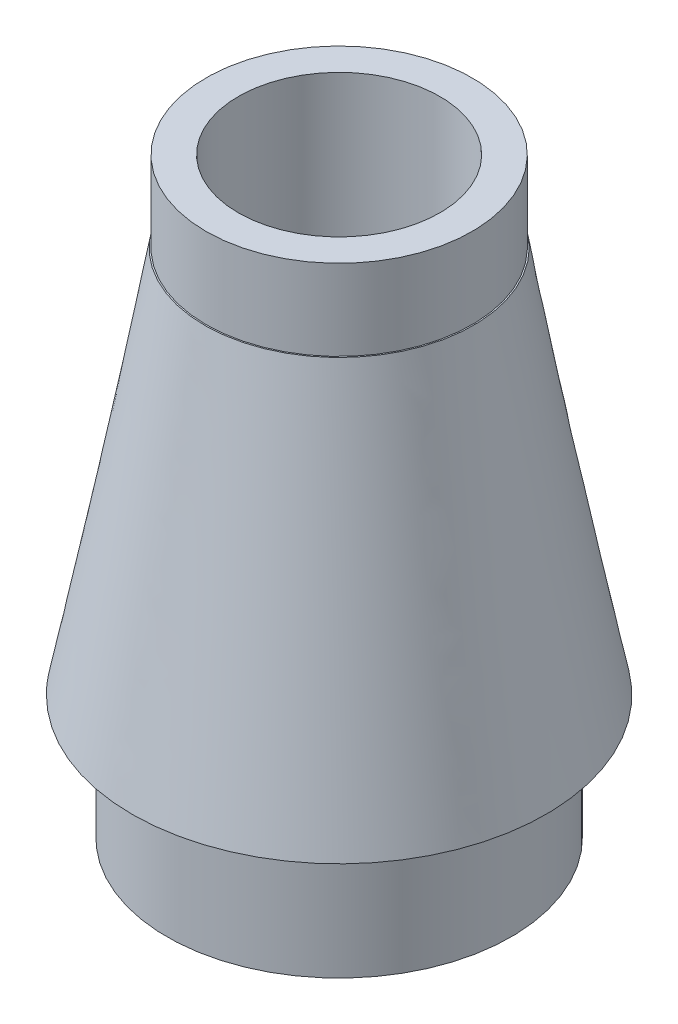
ISO-10303-21;
HEADER;
FILE_DESCRIPTION(('STEP AP214'),'2;1');
FILE_NAME('part.step','',(''),(''),'','','');
FILE_SCHEMA(('AUTOMOTIVE_DESIGN { 1 0 10303 214 1 1 1 1 }'));
ENDSEC;
DATA;
#1=APPLICATION_CONTEXT('core data for automotive mechanical design processes');
#2=APPLICATION_PROTOCOL_DEFINITION('international standard','automotive_design',2000,#1);
#3=PRODUCT_CONTEXT('',#1,'mechanical');
#4=PRODUCT('Part','Part','',(#3));
#5=PRODUCT_RELATED_PRODUCT_CATEGORY('part','',(#4));
#6=PRODUCT_DEFINITION_FORMATION('','',#4);
#7=PRODUCT_DEFINITION_CONTEXT('part definition',#1,'design');
#8=PRODUCT_DEFINITION('design','',#6,#7);
#9=PRODUCT_DEFINITION_SHAPE('','',#8);
#10=(LENGTH_UNIT() NAMED_UNIT(*) SI_UNIT(.MILLI.,.METRE.));
#11=(NAMED_UNIT(*) PLANE_ANGLE_UNIT() SI_UNIT($,.RADIAN.));
#12=(NAMED_UNIT(*) SI_UNIT($,.STERADIAN.) SOLID_ANGLE_UNIT());
#13=UNCERTAINTY_MEASURE_WITH_UNIT(LENGTH_MEASURE(1.E-05),#10,'distance_accuracy_value','');
#14=(GEOMETRIC_REPRESENTATION_CONTEXT(3) GLOBAL_UNCERTAINTY_ASSIGNED_CONTEXT((#13)) GLOBAL_UNIT_ASSIGNED_CONTEXT((#10,
#11,#12)) REPRESENTATION_CONTEXT('',''));
#15=CARTESIAN_POINT('',(0.,0.,0.));
#16=DIRECTION('',(0.,0.,1.));
#17=DIRECTION('',(1.,0.,0.));
#18=AXIS2_PLACEMENT_3D('',#15,#16,#17);
#19=CARTESIAN_POINT('',(0.,2.3,0.));
#20=DIRECTION('',(0.,1.,0.));
#21=DIRECTION('',(0.,0.,1.));
#22=AXIS2_PLACEMENT_3D('',#19,#20,#21);
#23=PLANE('',#22);
#24=CARTESIAN_POINT('',(0.,2.3,0.));
#25=DIRECTION('',(0.,1.,0.));
#26=DIRECTION('',(0.,0.,1.));
#27=AXIS2_PLACEMENT_3D('',#24,#25,#26);
#28=CIRCLE('',#27,3.85);
#29=CARTESIAN_POINT('',(3.50290491011307,2.3,-1.59754724208887));
#30=VERTEX_POINT('',#29);
#31=EDGE_CURVE('E46',#30,#30,#28,.T.);
#32=ORIENTED_EDGE('',*,*,#31,.F.);
#33=EDGE_LOOP('',(#32));
#34=FACE_BOUND('',#33,.T.);
#35=CARTESIAN_POINT('',(0.,2.29999999999109,0.));
#36=DIRECTION('',(0.,1.,0.));
#37=DIRECTION('',(0.,0.,1.));
#38=AXIS2_PLACEMENT_3D('',#35,#36,#37);
#39=CIRCLE('',#38,3.2);
#40=CARTESIAN_POINT('',(0.,2.29999999999109,-3.2));
#41=VERTEX_POINT('',#40);
#42=EDGE_CURVE('E11',#41,#41,#39,.F.);
#43=ORIENTED_EDGE('',*,*,#42,.F.);
#44=EDGE_LOOP('',(#43));
#45=FACE_BOUND('',#44,.T.);
#46=ADVANCED_FACE('F34',(#34,#45),#23,.F.);
#47=CARTESIAN_POINT('',(0.,9.5,0.));
#48=DIRECTION('',(0.,1.,0.));
#49=DIRECTION('',(0.,0.,1.));
#50=AXIS2_PLACEMENT_3D('',#47,#48,#49);
#51=PLANE('',#50);
#52=CARTESIAN_POINT('',(0.,9.50000000000273,0.));
#53=DIRECTION('',(0.,1.,0.));
#54=DIRECTION('',(0.,0.,1.));
#55=AXIS2_PLACEMENT_3D('',#52,#53,#54);
#56=CIRCLE('',#55,2.475);
#57=CARTESIAN_POINT('',(0.,9.50000000000273,2.475));
#58=VERTEX_POINT('',#57);
#59=EDGE_CURVE('E42',#58,#58,#56,.T.);
#60=ORIENTED_EDGE('',*,*,#59,.F.);
#61=EDGE_LOOP('',(#60));
#62=FACE_BOUND('',#61,.T.);
#63=CARTESIAN_POINT('',(0.,9.5,0.));
#64=DIRECTION('',(0.,1.,0.));
#65=DIRECTION('',(0.,0.,1.));
#66=AXIS2_PLACEMENT_3D('',#63,#64,#65);
#67=CIRCLE('',#66,2.5);
#68=CARTESIAN_POINT('',(2.46542534057247,9.5,-0.414340307070299));
#69=VERTEX_POINT('',#68);
#70=EDGE_CURVE('E50',#69,#69,#67,.T.);
#71=ORIENTED_EDGE('',*,*,#70,.T.);
#72=EDGE_LOOP('',(#71));
#73=FACE_BOUND('',#72,.T.);
#74=ADVANCED_FACE('F36',(#62,#73),#51,.T.);
#75=CARTESIAN_POINT('',(3.50290491011307,2.3,-1.59754724208887));
#76=CARTESIAN_POINT('',(2.46542534057247,9.5,-0.414340307070299));
#77=CARTESIAN_POINT('',(0.307810425935332,2.3,-8.603357062315));
#78=CARTESIAN_POINT('',(1.63674472643187,9.5,-5.34519098821524));
#79=CARTESIAN_POINT('',(-6.6979993942908,2.3,-5.40826257813726));
#80=CARTESIAN_POINT('',(-3.29410595471307,9.5,-4.51651037407464));
#81=CARTESIAN_POINT('',(-3.50290491011307,2.3,1.59754724208887));
#82=CARTESIAN_POINT('',(-2.46542534057247,9.5,0.4143403070703));
#83=CARTESIAN_POINT('',(-0.307810425935336,2.3,8.60335706231501));
#84=CARTESIAN_POINT('',(-1.63674472643187,9.5,5.34519098821524));
#85=CARTESIAN_POINT('',(6.6979993942908,2.3,5.40826257813727));
#86=CARTESIAN_POINT('',(3.29410595471307,9.5,4.51651037407464));
#87=CARTESIAN_POINT('',(3.50290491011307,2.3,-1.59754724208887));
#88=CARTESIAN_POINT('',(2.46542534057247,9.5,-0.414340307070299));
#89=(BOUNDED_SURFACE() B_SPLINE_SURFACE(3,1,((#75,#76),(#77,#78),(#79,#80),(#81,#82),(#83,#84),
(#85,#86),(#87,#88)),.UNSPECIFIED.,.T.,.F.,.F.) B_SPLINE_SURFACE_WITH_KNOTS((4,3,4),(2,2),(0.,
0.5,1.),(0.,1.),.UNSPECIFIED.) GEOMETRIC_REPRESENTATION_ITEM() RATIONAL_B_SPLINE_SURFACE(((1.,
1.),(0.333333333333334,0.333333333333333),(0.333333333333334,0.333333333333333),(1.,1.),
(0.333333333333333,0.333333333333333),(0.333333333333333,0.333333333333333),(1.,1.))) REPRESENTATION_ITEM('') SURFACE());
#90=CARTESIAN_POINT('',(3.50290491011307,2.3,-1.59754724208887));
#91=CARTESIAN_POINT('',(3.49209783126369,2.375,-1.58522216984909));
#92=CARTESIAN_POINT('',(3.48129075241431,2.45,-1.57289709760932));
#93=CARTESIAN_POINT('',(3.45967659471554,2.6,-1.54824695312976));
#94=CARTESIAN_POINT('',(3.44886951586616,2.675,-1.53592188088999));
#95=CARTESIAN_POINT('',(3.4272553581674,2.825,-1.51127173641043));
#96=CARTESIAN_POINT('',(3.41644827931802,2.9,-1.49894666417066));
#97=CARTESIAN_POINT('',(3.39483412161926,3.05,-1.4742965196911));
#98=CARTESIAN_POINT('',(3.38402704276988,3.125,-1.46197144745133));
#99=CARTESIAN_POINT('',(3.36241288507111,3.275,-1.43732130297177));
#100=CARTESIAN_POINT('',(3.35160580622173,3.35,-1.42499623073199));
#101=CARTESIAN_POINT('',(3.32999164852297,3.5,-1.40034608625244));
#102=CARTESIAN_POINT('',(3.31918456967359,3.575,-1.38802101401266));
#103=CARTESIAN_POINT('',(3.29757041197483,3.725,-1.36337086953311));
#104=CARTESIAN_POINT('',(3.28676333312544,3.8,-1.35104579729333));
#105=CARTESIAN_POINT('',(3.26514917542668,3.95,-1.32639565281378));
#106=CARTESIAN_POINT('',(3.2543420965773,4.025,-1.314070580574));
#107=CARTESIAN_POINT('',(3.23272793887854,4.175,-1.28942043609445));
#108=CARTESIAN_POINT('',(3.22192086002916,4.25,-1.27709536385467));
#109=CARTESIAN_POINT('',(3.20030670233039,4.4,-1.25244521937512));
#110=CARTESIAN_POINT('',(3.18949962348101,4.475,-1.24012014713534));
#111=CARTESIAN_POINT('',(3.16788546578225,4.625,-1.21547000265579));
#112=CARTESIAN_POINT('',(3.15707838693287,4.7,-1.20314493041601));
#113=CARTESIAN_POINT('',(3.13546422923411,4.85,-1.17849478593646));
#114=CARTESIAN_POINT('',(3.12465715038473,4.925,-1.16616971369668));
#115=CARTESIAN_POINT('',(3.10304299268596,5.075,-1.14151956921713));
#116=CARTESIAN_POINT('',(3.09223591383658,5.15,-1.12919449697735));
#117=CARTESIAN_POINT('',(3.07062175613782,5.3,-1.1045443524978));
#118=CARTESIAN_POINT('',(3.05981467728844,5.375,-1.09221928025802));
#119=CARTESIAN_POINT('',(3.03820051958968,5.525,-1.06756913577847));
#120=CARTESIAN_POINT('',(3.02739344074029,5.6,-1.05524406353869));
#121=CARTESIAN_POINT('',(3.00577928304153,5.75,-1.03059391905914));
#122=CARTESIAN_POINT('',(2.99497220419215,5.825,-1.01826884681936));
#123=CARTESIAN_POINT('',(2.97335804649339,5.975,-0.993618702339808));
#124=CARTESIAN_POINT('',(2.96255096764401,6.05,-0.981293630100031));
#125=CARTESIAN_POINT('',(2.94093680994525,6.2,-0.956643485620478));
#126=CARTESIAN_POINT('',(2.93012973109586,6.275,-0.944318413380701));
#127=CARTESIAN_POINT('',(2.9085155733971,6.425,-0.919668268901147));
#128=CARTESIAN_POINT('',(2.89770849454772,6.5,-0.90734319666137));
#129=CARTESIAN_POINT('',(2.87609433684896,6.65,-0.882693052181817));
#130=CARTESIAN_POINT('',(2.86528725799958,6.725,-0.87036797994204));
#131=CARTESIAN_POINT('',(2.84367310030081,6.875,-0.845717835462486));
#132=CARTESIAN_POINT('',(2.83286602145143,6.95,-0.83339276322271));
#133=CARTESIAN_POINT('',(2.81125186375267,7.1,-0.808742618743156));
#134=CARTESIAN_POINT('',(2.80044478490329,7.175,-0.796417546503379));
#135=CARTESIAN_POINT('',(2.77883062720453,7.325,-0.771767402023826));
#136=CARTESIAN_POINT('',(2.76802354835515,7.4,-0.759442329784049));
#137=CARTESIAN_POINT('',(2.74640939065638,7.55,-0.734792185304496));
#138=CARTESIAN_POINT('',(2.735602311807,7.625,-0.722467113064719));
#139=CARTESIAN_POINT('',(2.71398815410824,7.775,-0.697816968585165));
#140=CARTESIAN_POINT('',(2.70318107525886,7.85,-0.685491896345388));
#141=CARTESIAN_POINT('',(2.6815669175601,8.,-0.660841751865835));
#142=CARTESIAN_POINT('',(2.67075983871071,8.075,-0.648516679626058));
#143=CARTESIAN_POINT('',(2.64914568101195,8.225,-0.623866535146504));
#144=CARTESIAN_POINT('',(2.63833860216257,8.3,-0.611541462906728));
#145=CARTESIAN_POINT('',(2.61672444446381,8.45,-0.586891318427174));
#146=CARTESIAN_POINT('',(2.60591736561443,8.525,-0.574566246187397));
#147=CARTESIAN_POINT('',(2.58430320791567,8.675,-0.549916101707844));
#148=CARTESIAN_POINT('',(2.57349612906628,8.75,-0.537591029468067));
#149=CARTESIAN_POINT('',(2.55188197136752,8.9,-0.512940884988514));
#150=CARTESIAN_POINT('',(2.54107489251814,8.975,-0.500615812748737));
#151=CARTESIAN_POINT('',(2.51946073481938,9.125,-0.475965668269183));
#152=CARTESIAN_POINT('',(2.50865365597,9.2,-0.463640596029406));
#153=CARTESIAN_POINT('',(2.48703949827124,9.35,-0.438990451549853));
#154=CARTESIAN_POINT('',(2.47623241942185,9.425,-0.426665379310076));
#155=CARTESIAN_POINT('',(2.46542534057247,9.5,-0.414340307070299));
#156=B_SPLINE_CURVE_WITH_KNOTS('',3,(#90,#91,#92,#93,#94,#95,#96,#97,#98,#99,#100,#101,#102,
#103,#104,#105,#106,#107,#108,#109,#110,#111,#112,#113,#114,#115,#116,#117,#118,#119,#120,#121,
#122,#123,#124,#125,#126,#127,#128,#129,#130,#131,#132,#133,#134,#135,#136,#137,#138,#139,#140,
#141,#142,#143,#144,#145,#146,#147,#148,#149,#150,#151,#152,#153,#154,#155),.UNSPECIFIED.,.F.,
.F.,(4,2,2,2,2,2,2,2,2,2,2,2,2,2,2,2,2,2,2,2,2,2,2,2,2,2,2,2,2,2,2,2,4),(0.,0.230311318069156,
0.460622636138313,0.690933954207469,0.921245272276625,1.15155659034578,1.38186790841494,
1.61217922648409,1.84249054455325,2.07280186262241,2.30311318069156,2.53342449876072,
2.76373581682988,2.99404713489903,3.22435845296819,3.45466977103735,3.6849810891065,
3.91529240717566,4.14560372524481,4.37591504331397,4.60622636138313,4.83653767945228,
5.06684899752144,5.2971603155906,5.52747163365975,5.75778295172891,5.98809426979806,
6.21840558786722,6.44871690593638,6.67902822400553,6.90933954207469,7.13965086014384,
7.369962178213),.UNSPECIFIED.);
#157=EDGE_CURVE('BSEAM88',#30,#69,#156,.T.);
#158=ORIENTED_EDGE('',*,*,#31,.T.);
#159=ORIENTED_EDGE('',*,*,#70,.F.);
#160=ORIENTED_EDGE('',*,*,#157,.T.);
#161=ORIENTED_EDGE('',*,*,#157,.F.);
#162=EDGE_LOOP('',(#158,#160,#159,#161));
#163=FACE_BOUND('',#162,.T.);
#164=ADVANCED_FACE('F88',(#163),#89,.T.);
#165=CARTESIAN_POINT('',(0.,-500000.,0.));
#166=DIRECTION('',(0.,1.,0.));
#167=DIRECTION('',(0.,0.,1.));
#168=AXIS2_PLACEMENT_3D('',#165,#166,#167);
#169=CYLINDRICAL_SURFACE('',#168,2.475);
#170=ORIENTED_EDGE('',*,*,#59,.T.);
#171=EDGE_LOOP('',(#170));
#172=FACE_BOUND('',#171,.T.);
#173=CARTESIAN_POINT('',(0.,11.,0.));
#174=DIRECTION('',(0.,1.,0.));
#175=DIRECTION('',(0.,0.,1.));
#176=AXIS2_PLACEMENT_3D('',#173,#174,#175);
#177=CIRCLE('',#176,2.475);
#178=CARTESIAN_POINT('',(0.,11.,2.475));
#179=VERTEX_POINT('',#178);
#180=EDGE_CURVE('E57',#179,#179,#177,.T.);
#181=ORIENTED_EDGE('',*,*,#180,.F.);
#182=EDGE_LOOP('',(#181));
#183=FACE_BOUND('',#182,.T.);
#184=ADVANCED_FACE('F86',(#172,#183),#169,.T.);
#185=CARTESIAN_POINT('',(0.,11.,0.));
#186=DIRECTION('',(0.,1.,0.));
#187=DIRECTION('',(0.,0.,1.));
#188=AXIS2_PLACEMENT_3D('',#185,#186,#187);
#189=PLANE('',#188);
#190=CARTESIAN_POINT('',(0.,11.,0.));
#191=DIRECTION('',(0.,1.,0.));
#192=DIRECTION('',(0.,0.,1.));
#193=AXIS2_PLACEMENT_3D('',#190,#191,#192);
#194=CIRCLE('',#193,1.875);
#195=CARTESIAN_POINT('',(0.,11.,1.875));
#196=VERTEX_POINT('',#195);
#197=EDGE_CURVE('E129',#196,#196,#194,.T.);
#198=ORIENTED_EDGE('',*,*,#197,.F.);
#199=EDGE_LOOP('',(#198));
#200=FACE_BOUND('',#199,.T.);
#201=ORIENTED_EDGE('',*,*,#180,.T.);
#202=EDGE_LOOP('',(#201));
#203=FACE_BOUND('',#202,.T.);
#204=ADVANCED_FACE('F94',(#200,#203),#189,.T.);
#205=CARTESIAN_POINT('',(0.,0.,0.));
#206=DIRECTION('',(0.,1.,0.));
#207=DIRECTION('',(0.,0.,1.));
#208=AXIS2_PLACEMENT_3D('',#205,#206,#207);
#209=PLANE('',#208);
#210=CARTESIAN_POINT('',(0.,0.,0.));
#211=DIRECTION('',(0.,-1.,0.));
#212=DIRECTION('',(0.,0.,-1.));
#213=AXIS2_PLACEMENT_3D('',#210,#211,#212);
#214=CIRCLE('',#213,2.475);
#215=CARTESIAN_POINT('',(0.,0.,-2.475));
#216=VERTEX_POINT('',#215);
#217=EDGE_CURVE('E126',#216,#216,#214,.T.);
#218=ORIENTED_EDGE('',*,*,#217,.F.);
#219=EDGE_LOOP('',(#218));
#220=FACE_BOUND('',#219,.T.);
#221=CARTESIAN_POINT('',(0.,0.,0.));
#222=DIRECTION('',(0.,1.,0.));
#223=DIRECTION('',(0.,0.,1.));
#224=AXIS2_PLACEMENT_3D('',#221,#222,#223);
#225=CIRCLE('',#224,3.2);
#226=CARTESIAN_POINT('',(0.,0.,-3.2));
#227=VERTEX_POINT('',#226);
#228=EDGE_CURVE('E122',#227,#227,#225,.T.);
#229=ORIENTED_EDGE('',*,*,#228,.F.);
#230=EDGE_LOOP('',(#229));
#231=FACE_BOUND('',#230,.T.);
#232=ADVANCED_FACE('F142',(#220,#231),#209,.F.);
#233=CARTESIAN_POINT('',(0.,500000.,0.));
#234=DIRECTION('',(0.,-1.,0.));
#235=DIRECTION('',(0.,0.,-1.));
#236=AXIS2_PLACEMENT_3D('',#233,#234,#235);
#237=CYLINDRICAL_SURFACE('',#236,3.2);
#238=CARTESIAN_POINT('',(0.,0.,-3.2));
#239=CARTESIAN_POINT('',(0.,0.0239583333344247,-3.2));
#240=CARTESIAN_POINT('',(0.,0.0479166666688495,-3.2));
#241=CARTESIAN_POINT('',(0.,0.0958333333376989,-3.2));
#242=CARTESIAN_POINT('',(0.,0.119791666672124,-3.2));
#243=CARTESIAN_POINT('',(0.,0.167708333340973,-3.2));
#244=CARTESIAN_POINT('',(0.,0.191666666675398,-3.2));
#245=CARTESIAN_POINT('',(0.,0.239583333344247,-3.2));
#246=CARTESIAN_POINT('',(0.,0.263541666678672,-3.2));
#247=CARTESIAN_POINT('',(0.,0.311458333347521,-3.2));
#248=CARTESIAN_POINT('',(0.,0.335416666681946,-3.2));
#249=CARTESIAN_POINT('',(0.,0.383333333350796,-3.2));
#250=CARTESIAN_POINT('',(0.,0.40729166668522,-3.2));
#251=CARTESIAN_POINT('',(0.,0.45520833335407,-3.2));
#252=CARTESIAN_POINT('',(0.,0.479166666688495,-3.2));
#253=CARTESIAN_POINT('',(0.,0.527083333357344,-3.2));
#254=CARTESIAN_POINT('',(0.,0.551041666691769,-3.2));
#255=CARTESIAN_POINT('',(0.,0.59895833334167,-3.2));
#256=CARTESIAN_POINT('',(0.,0.622916666657147,-3.2));
#257=CARTESIAN_POINT('',(0.,0.670833333307049,-3.2));
#258=CARTESIAN_POINT('',(0.,0.694791666641474,-3.2));
#259=CARTESIAN_POINT('',(0.,0.742708333310323,-3.2));
#260=CARTESIAN_POINT('',(0.,0.766666666644748,-3.2));
#261=CARTESIAN_POINT('',(0.,0.814583333313597,-3.2));
#262=CARTESIAN_POINT('',(0.,0.838541666648022,-3.2));
#263=CARTESIAN_POINT('',(0.,0.886458333316872,-3.2));
#264=CARTESIAN_POINT('',(0.,0.910416666651296,-3.2));
#265=CARTESIAN_POINT('',(0.,0.958333333320146,-3.2));
#266=CARTESIAN_POINT('',(0.,0.98229166665457,-3.2));
#267=CARTESIAN_POINT('',(0.,1.03020833332342,-3.2));
#268=CARTESIAN_POINT('',(0.,1.05416666665784,-3.2));
#269=CARTESIAN_POINT('',(0.,1.10208333332669,-3.2));
#270=CARTESIAN_POINT('',(0.,1.12604166666112,-3.2));
#271=CARTESIAN_POINT('',(0.,1.17395833332997,-3.2));
#272=CARTESIAN_POINT('',(0.,1.19791666666439,-3.2));
#273=CARTESIAN_POINT('',(0.,1.24583333333324,-3.2));
#274=CARTESIAN_POINT('',(0.,1.26979166666767,-3.2));
#275=CARTESIAN_POINT('',(0.,1.31770833333652,-3.2));
#276=CARTESIAN_POINT('',(0.,1.34166666667094,-3.2));
#277=CARTESIAN_POINT('',(0.,1.38958333333979,-3.2));
#278=CARTESIAN_POINT('',(0.,1.41354166667422,-3.2));
#279=CARTESIAN_POINT('',(0.,1.46145833334306,-3.2));
#280=CARTESIAN_POINT('',(0.,1.48541666667749,-3.2));
#281=CARTESIAN_POINT('',(0.,1.53333333334634,-3.2));
#282=CARTESIAN_POINT('',(0.,1.55729166668076,-3.2));
#283=CARTESIAN_POINT('',(0.,1.60520833334961,-3.2));
#284=CARTESIAN_POINT('',(0.,1.62916666668404,-3.2));
#285=CARTESIAN_POINT('',(0.,1.67708333333394,-3.2));
#286=CARTESIAN_POINT('',(0.,1.70104166664942,-3.2));
#287=CARTESIAN_POINT('',(0.,1.74895833329932,-3.2));
#288=CARTESIAN_POINT('',(0.,1.77291666663374,-3.2));
#289=CARTESIAN_POINT('',(0.,1.82083333330259,-3.2));
#290=CARTESIAN_POINT('',(0.,1.84479166663702,-3.2));
#291=CARTESIAN_POINT('',(0.,1.89270833330587,-3.2));
#292=CARTESIAN_POINT('',(0.,1.91666666664029,-3.2));
#293=CARTESIAN_POINT('',(0.,1.96458333330914,-3.2));
#294=CARTESIAN_POINT('',(0.,1.98854166664357,-3.2));
#295=CARTESIAN_POINT('',(0.,2.03645833331242,-3.2));
#296=CARTESIAN_POINT('',(0.,2.06041666664684,-3.2));
#297=CARTESIAN_POINT('',(0.,2.10833333331569,-3.2));
#298=CARTESIAN_POINT('',(0.,2.13229166665011,-3.2));
#299=CARTESIAN_POINT('',(0.,2.18020833331896,-3.2));
#300=CARTESIAN_POINT('',(0.,2.20416666665339,-3.2));
#301=CARTESIAN_POINT('',(0.,2.25208333332224,-3.2));
#302=CARTESIAN_POINT('',(0.,2.27604166665666,-3.2));
#303=CARTESIAN_POINT('',(0.,2.29999999999109,-3.2));
#304=B_SPLINE_CURVE_WITH_KNOTS('',3,(#238,#239,#240,#241,#242,#243,#244,#245,#246,#247,#248,
#249,#250,#251,#252,#253,#254,#255,#256,#257,#258,#259,#260,#261,#262,#263,#264,#265,#266,#267,
#268,#269,#270,#271,#272,#273,#274,#275,#276,#277,#278,#279,#280,#281,#282,#283,#284,#285,#286,
#287,#288,#289,#290,#291,#292,#293,#294,#295,#296,#297,#298,#299,#300,#301,#302,#303),
.UNSPECIFIED.,.F.,.F.,(4,2,2,2,2,2,2,2,2,2,2,2,2,2,2,2,2,2,2,2,2,2,2,2,2,2,2,2,2,2,2,2,4),(0.,
0.0718750000032742,0.143750000006548,0.215625000009823,0.287500000013097,0.359375000016371,
0.431250000019645,0.503125000022919,0.575000000026193,0.646874999972624,0.718749999975898,
0.790624999979173,0.862499999982447,0.934374999985721,1.006249999989,1.07812499999227,
1.14999999999554,1.22187499999882,1.29375000000209,1.36562500000537,1.43750000000864,
1.50937500001191,1.58125000001519,1.65312500001846,1.72499999996489,1.79687499996817,
1.86874999997144,1.94062499997472,2.01249999997799,2.08437499998126,2.15624999998454,
2.22812499998781,2.29999999999109),.UNSPECIFIED.);
#305=EDGE_CURVE('BSEAM149',#227,#41,#304,.T.);
#306=ORIENTED_EDGE('',*,*,#228,.T.);
#307=ORIENTED_EDGE('',*,*,#42,.T.);
#308=ORIENTED_EDGE('',*,*,#305,.T.);
#309=ORIENTED_EDGE('',*,*,#305,.F.);
#310=EDGE_LOOP('',(#306,#308,#307,#309));
#311=FACE_BOUND('',#310,.T.);
#312=ADVANCED_FACE('F149',(#311),#237,.T.);
#313=CARTESIAN_POINT('',(0.,4.,0.));
#314=DIRECTION('',(0.,-1.,0.));
#315=DIRECTION('',(0.,0.,-1.));
#316=AXIS2_PLACEMENT_3D('',#313,#314,#315);
#317=CYLINDRICAL_SURFACE('',#316,2.475);
#318=CARTESIAN_POINT('',(0.,4.,0.));
#319=DIRECTION('',(0.,-1.,0.));
#320=DIRECTION('',(0.,0.,-1.));
#321=AXIS2_PLACEMENT_3D('',#318,#319,#320);
#322=CIRCLE('',#321,2.475);
#323=CARTESIAN_POINT('',(0.,4.,-2.475));
#324=VERTEX_POINT('',#323);
#325=EDGE_CURVE('E125',#324,#324,#322,.T.);
#326=ORIENTED_EDGE('',*,*,#325,.F.);
#327=EDGE_LOOP('',(#326));
#328=FACE_BOUND('',#327,.T.);
#329=ORIENTED_EDGE('',*,*,#217,.T.);
#330=EDGE_LOOP('',(#329));
#331=FACE_BOUND('',#330,.T.);
#332=ADVANCED_FACE('F155',(#328,#331),#317,.F.);
#333=CARTESIAN_POINT('',(0.,4.,0.));
#334=DIRECTION('',(0.,-1.,0.));
#335=DIRECTION('',(0.,0.,-1.));
#336=AXIS2_PLACEMENT_3D('',#333,#334,#335);
#337=PLANE('',#336);
#338=CARTESIAN_POINT('',(0.,4.,0.));
#339=DIRECTION('',(0.,-1.,0.));
#340=DIRECTION('',(0.,0.,-1.));
#341=AXIS2_PLACEMENT_3D('',#338,#339,#340);
#342=CIRCLE('',#341,1.875);
#343=CARTESIAN_POINT('',(0.,4.,-1.875));
#344=VERTEX_POINT('',#343);
#345=EDGE_CURVE('E132',#344,#344,#342,.F.);
#346=ORIENTED_EDGE('',*,*,#345,.T.);
#347=EDGE_LOOP('',(#346));
#348=FACE_BOUND('',#347,.T.);
#349=ORIENTED_EDGE('',*,*,#325,.T.);
#350=EDGE_LOOP('',(#349));
#351=FACE_BOUND('',#350,.T.);
#352=ADVANCED_FACE('F163',(#348,#351),#337,.T.);
#353=CARTESIAN_POINT('',(0.,-0.000999999999999265,0.));
#354=DIRECTION('',(0.,1.,0.));
#355=DIRECTION('',(0.,0.,1.));
#356=AXIS2_PLACEMENT_3D('',#353,#354,#355);
#357=CYLINDRICAL_SURFACE('',#356,1.875);
#358=ORIENTED_EDGE('',*,*,#345,.F.);
#359=EDGE_LOOP('',(#358));
#360=FACE_BOUND('',#359,.T.);
#361=ORIENTED_EDGE('',*,*,#197,.T.);
#362=EDGE_LOOP('',(#361));
#363=FACE_BOUND('',#362,.T.);
#364=ADVANCED_FACE('F138',(#360,#363),#357,.F.);
#365=CLOSED_SHELL('',(#46,#74,#164,#184,#204,#232,#312,#332,#352,#364));
#366=MANIFOLD_SOLID_BREP('B2',#365);
#367=ADVANCED_BREP_SHAPE_REPRESENTATION('',(#18,#366),#14);
#368=SHAPE_DEFINITION_REPRESENTATION(#9,#367);
ENDSEC;
END-ISO-10303-21;
